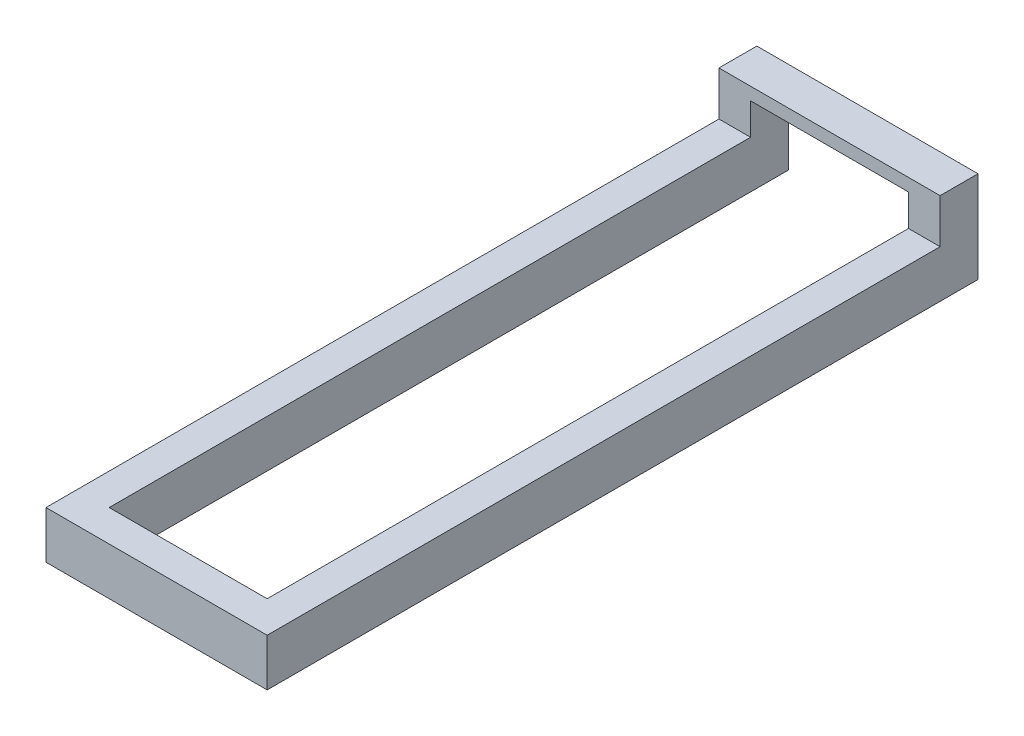
ISO-10303-21;
HEADER;
FILE_DESCRIPTION(('STEP AP214'),'2;1');
FILE_NAME('part.step','',(''),(''),'','','');
FILE_SCHEMA(('AUTOMOTIVE_DESIGN { 1 0 10303 214 1 1 1 1 }'));
ENDSEC;
DATA;
#1=APPLICATION_CONTEXT('core data for automotive mechanical design processes');
#2=APPLICATION_PROTOCOL_DEFINITION('international standard','automotive_design',2000,#1);
#3=PRODUCT_CONTEXT('',#1,'mechanical');
#4=PRODUCT('Part','Part','',(#3));
#5=PRODUCT_RELATED_PRODUCT_CATEGORY('part','',(#4));
#6=PRODUCT_DEFINITION_FORMATION('','',#4);
#7=PRODUCT_DEFINITION_CONTEXT('part definition',#1,'design');
#8=PRODUCT_DEFINITION('design','',#6,#7);
#9=PRODUCT_DEFINITION_SHAPE('','',#8);
#10=(LENGTH_UNIT() NAMED_UNIT(*) SI_UNIT(.MILLI.,.METRE.));
#11=(NAMED_UNIT(*) PLANE_ANGLE_UNIT() SI_UNIT($,.RADIAN.));
#12=(NAMED_UNIT(*) SI_UNIT($,.STERADIAN.) SOLID_ANGLE_UNIT());
#13=UNCERTAINTY_MEASURE_WITH_UNIT(LENGTH_MEASURE(1.E-05),#10,'distance_accuracy_value','');
#14=(GEOMETRIC_REPRESENTATION_CONTEXT(3) GLOBAL_UNCERTAINTY_ASSIGNED_CONTEXT((#13)) GLOBAL_UNIT_ASSIGNED_CONTEXT((#10,
#11,#12)) REPRESENTATION_CONTEXT('',''));
#15=CARTESIAN_POINT('',(0.,0.,0.));
#16=DIRECTION('',(0.,0.,1.));
#17=DIRECTION('',(1.,0.,0.));
#18=AXIS2_PLACEMENT_3D('',#15,#16,#17);
#19=CARTESIAN_POINT('',(0.,7.5,0.));
#20=DIRECTION('',(0.,1.,0.));
#21=DIRECTION('',(0.,0.,1.));
#22=AXIS2_PLACEMENT_3D('',#19,#20,#21);
#23=PLANE('',#22);
#24=DIRECTION('',(0.,0.,-1.));
#25=VECTOR('',#24,1.);
#26=CARTESIAN_POINT('',(35.,7.5,-107.5));
#27=LINE('',#26,#25);
#28=CARTESIAN_POINT('',(35.,7.5,117.5));
#29=VERTEX_POINT('',#28);
#30=CARTESIAN_POINT('',(35.,7.5,-95.4999999999999));
#31=VERTEX_POINT('',#30);
#32=EDGE_CURVE('E55',#29,#31,#27,.T.);
#33=ORIENTED_EDGE('',*,*,#32,.T.);
#34=DIRECTION('',(1.,0.,0.));
#35=VECTOR('',#34,1.);
#36=CARTESIAN_POINT('',(0.,7.5,-95.4999999999999));
#37=LINE('',#36,#35);
#38=CARTESIAN_POINT('',(25.,7.5,-95.4999999999999));
#39=VERTEX_POINT('',#38);
#40=EDGE_CURVE('E155',#39,#31,#37,.T.);
#41=ORIENTED_EDGE('',*,*,#40,.F.);
#42=DIRECTION('',(0.,0.,1.));
#43=VECTOR('',#42,1.);
#44=CARTESIAN_POINT('',(25.,7.5,-107.5));
#45=LINE('',#44,#43);
#46=CARTESIAN_POINT('',(25.,7.5,107.5));
#47=VERTEX_POINT('',#46);
#48=EDGE_CURVE('E154',#39,#47,#45,.T.);
#49=ORIENTED_EDGE('',*,*,#48,.T.);
#50=DIRECTION('',(-1.,0.,0.));
#51=VECTOR('',#50,1.);
#52=CARTESIAN_POINT('',(-25.,7.5,107.5));
#53=LINE('',#52,#51);
#54=CARTESIAN_POINT('',(-25.,7.5,107.5));
#55=VERTEX_POINT('',#54);
#56=EDGE_CURVE('E180',#47,#55,#53,.T.);
#57=ORIENTED_EDGE('',*,*,#56,.T.);
#58=DIRECTION('',(0.,0.,-1.));
#59=VECTOR('',#58,1.);
#60=CARTESIAN_POINT('',(-25.,7.5,-107.5));
#61=LINE('',#60,#59);
#62=CARTESIAN_POINT('',(-25.,7.5,-95.4999999999999));
#63=VERTEX_POINT('',#62);
#64=EDGE_CURVE('E183',#55,#63,#61,.T.);
#65=ORIENTED_EDGE('',*,*,#64,.T.);
#66=DIRECTION('',(-1.,0.,0.));
#67=VECTOR('',#66,1.);
#68=CARTESIAN_POINT('',(0.,7.5,-95.4999999999999));
#69=LINE('',#68,#67);
#70=CARTESIAN_POINT('',(-35.,7.5,-95.4999999999999));
#71=VERTEX_POINT('',#70);
#72=EDGE_CURVE('E62',#63,#71,#69,.T.);
#73=ORIENTED_EDGE('',*,*,#72,.T.);
#74=DIRECTION('',(0.,0.,1.));
#75=VECTOR('',#74,1.);
#76=CARTESIAN_POINT('',(-35.,7.5,117.5));
#77=LINE('',#76,#75);
#78=CARTESIAN_POINT('',(-35.,7.5,117.5));
#79=VERTEX_POINT('',#78);
#80=EDGE_CURVE('E185',#71,#79,#77,.T.);
#81=ORIENTED_EDGE('',*,*,#80,.T.);
#82=DIRECTION('',(1.,0.,0.));
#83=VECTOR('',#82,1.);
#84=CARTESIAN_POINT('',(35.,7.5,117.5));
#85=LINE('',#84,#83);
#86=EDGE_CURVE('E187',#79,#29,#85,.T.);
#87=ORIENTED_EDGE('',*,*,#86,.T.);
#88=EDGE_LOOP('',(#33,#41,#49,#57,#65,#73,#81,#87));
#89=FACE_BOUND('',#88,.T.);
#90=ADVANCED_FACE('F40',(#89),#23,.T.);
#91=CARTESIAN_POINT('',(25.,7.5,-107.5));
#92=DIRECTION('',(1.,0.,0.));
#93=DIRECTION('',(0.,0.,-1.));
#94=AXIS2_PLACEMENT_3D('',#91,#92,#93);
#95=PLANE('',#94);
#96=DIRECTION('',(0.,0.,1.));
#97=VECTOR('',#96,1.);
#98=CARTESIAN_POINT('',(25.,-7.5,-107.5));
#99=LINE('',#98,#97);
#100=CARTESIAN_POINT('',(25.,-7.5,-107.5));
#101=VERTEX_POINT('',#100);
#102=CARTESIAN_POINT('',(25.,-7.5,107.5));
#103=VERTEX_POINT('',#102);
#104=EDGE_CURVE('E174',#101,#103,#99,.T.);
#105=ORIENTED_EDGE('',*,*,#104,.T.);
#106=DIRECTION('',(0.,-1.,0.));
#107=VECTOR('',#106,1.);
#108=CARTESIAN_POINT('',(25.,7.5,107.5));
#109=LINE('',#108,#107);
#110=EDGE_CURVE('E11',#47,#103,#109,.T.);
#111=ORIENTED_EDGE('',*,*,#110,.F.);
#112=ORIENTED_EDGE('',*,*,#48,.F.);
#113=DIRECTION('',(0.,1.,0.));
#114=VECTOR('',#113,1.);
#115=CARTESIAN_POINT('',(24.9999999999999,0.,-95.4999999999999));
#116=LINE('',#115,#114);
#117=CARTESIAN_POINT('',(24.9999999999999,17.5,-95.4999999999999));
#118=VERTEX_POINT('',#117);
#119=EDGE_CURVE('E146',#39,#118,#116,.T.);
#120=ORIENTED_EDGE('',*,*,#119,.T.);
#121=DIRECTION('',(0.,0.,-1.));
#122=VECTOR('',#121,1.);
#123=CARTESIAN_POINT('',(24.9999999999999,17.5,-95.4999999999999));
#124=LINE('',#123,#122);
#125=CARTESIAN_POINT('',(24.9999999999999,17.5,-107.5));
#126=VERTEX_POINT('',#125);
#127=EDGE_CURVE('E129',#118,#126,#124,.T.);
#128=ORIENTED_EDGE('',*,*,#127,.T.);
#129=DIRECTION('',(0.,-1.,0.));
#130=VECTOR('',#129,1.);
#131=CARTESIAN_POINT('',(25.,7.5,-107.5));
#132=LINE('',#131,#130);
#133=EDGE_CURVE('E190',#126,#101,#132,.T.);
#134=ORIENTED_EDGE('',*,*,#133,.T.);
#135=EDGE_LOOP('',(#105,#111,#112,#120,#128,#134));
#136=FACE_BOUND('',#135,.T.);
#137=ADVANCED_FACE('F42',(#136),#95,.F.);
#138=CARTESIAN_POINT('',(-25.,7.5,107.5));
#139=DIRECTION('',(0.,0.,1.));
#140=DIRECTION('',(1.,0.,0.));
#141=AXIS2_PLACEMENT_3D('',#138,#139,#140);
#142=PLANE('',#141);
#143=DIRECTION('',(-1.,0.,0.));
#144=VECTOR('',#143,1.);
#145=CARTESIAN_POINT('',(-25.,-7.5,107.5));
#146=LINE('',#145,#144);
#147=CARTESIAN_POINT('',(-25.,-7.5,107.5));
#148=VERTEX_POINT('',#147);
#149=EDGE_CURVE('E192',#103,#148,#146,.T.);
#150=ORIENTED_EDGE('',*,*,#149,.T.);
#151=DIRECTION('',(0.,-1.,0.));
#152=VECTOR('',#151,1.);
#153=CARTESIAN_POINT('',(-25.,7.5,107.5));
#154=LINE('',#153,#152);
#155=EDGE_CURVE('E48',#55,#148,#154,.T.);
#156=ORIENTED_EDGE('',*,*,#155,.F.);
#157=ORIENTED_EDGE('',*,*,#56,.F.);
#158=ORIENTED_EDGE('',*,*,#110,.T.);
#159=EDGE_LOOP('',(#150,#156,#157,#158));
#160=FACE_BOUND('',#159,.T.);
#161=ADVANCED_FACE('F249',(#160),#142,.F.);
#162=CARTESIAN_POINT('',(-25.,7.5,-107.5));
#163=DIRECTION('',(-1.,0.,0.));
#164=DIRECTION('',(0.,0.,1.));
#165=AXIS2_PLACEMENT_3D('',#162,#163,#164);
#166=PLANE('',#165);
#167=DIRECTION('',(0.,0.,-1.));
#168=VECTOR('',#167,1.);
#169=CARTESIAN_POINT('',(-25.,-7.5,-107.5));
#170=LINE('',#169,#168);
#171=CARTESIAN_POINT('',(-25.,-7.5,-107.5));
#172=VERTEX_POINT('',#171);
#173=EDGE_CURVE('E194',#148,#172,#170,.T.);
#174=ORIENTED_EDGE('',*,*,#173,.T.);
#175=DIRECTION('',(0.,-1.,0.));
#176=VECTOR('',#175,1.);
#177=CARTESIAN_POINT('',(-25.,7.5,-107.5));
#178=LINE('',#177,#176);
#179=CARTESIAN_POINT('',(-25.0000000000002,17.5,-107.5));
#180=VERTEX_POINT('',#179);
#181=EDGE_CURVE('E218',#180,#172,#178,.T.);
#182=ORIENTED_EDGE('',*,*,#181,.F.);
#183=DIRECTION('',(0.,0.,-1.));
#184=VECTOR('',#183,1.);
#185=CARTESIAN_POINT('',(-25.0000000000002,17.5,-95.4999999999999));
#186=LINE('',#185,#184);
#187=CARTESIAN_POINT('',(-25.0000000000002,17.5,-95.4999999999999));
#188=VERTEX_POINT('',#187);
#189=EDGE_CURVE('E139',#188,#180,#186,.T.);
#190=ORIENTED_EDGE('',*,*,#189,.F.);
#191=DIRECTION('',(0.,1.,0.));
#192=VECTOR('',#191,1.);
#193=CARTESIAN_POINT('',(-25.0000000000002,0.,-95.4999999999999));
#194=LINE('',#193,#192);
#195=EDGE_CURVE('E148',#63,#188,#194,.T.);
#196=ORIENTED_EDGE('',*,*,#195,.F.);
#197=ORIENTED_EDGE('',*,*,#64,.F.);
#198=ORIENTED_EDGE('',*,*,#155,.T.);
#199=EDGE_LOOP('',(#174,#182,#190,#196,#197,#198));
#200=FACE_BOUND('',#199,.T.);
#201=ADVANCED_FACE('F225',(#200),#166,.F.);
#202=CARTESIAN_POINT('',(-35.,7.5,117.5));
#203=DIRECTION('',(1.,0.,0.));
#204=DIRECTION('',(0.,0.,-1.));
#205=AXIS2_PLACEMENT_3D('',#202,#203,#204);
#206=PLANE('',#205);
#207=DIRECTION('',(0.,0.,1.));
#208=VECTOR('',#207,1.);
#209=CARTESIAN_POINT('',(-35.,-7.5,117.5));
#210=LINE('',#209,#208);
#211=CARTESIAN_POINT('',(-35.,-7.5,-107.5));
#212=VERTEX_POINT('',#211);
#213=CARTESIAN_POINT('',(-35.,-7.5,117.5));
#214=VERTEX_POINT('',#213);
#215=EDGE_CURVE('E198',#212,#214,#210,.T.);
#216=ORIENTED_EDGE('',*,*,#215,.T.);
#217=DIRECTION('',(0.,-1.,0.));
#218=VECTOR('',#217,1.);
#219=CARTESIAN_POINT('',(-35.,7.5,117.5));
#220=LINE('',#219,#218);
#221=EDGE_CURVE('E212',#79,#214,#220,.T.);
#222=ORIENTED_EDGE('',*,*,#221,.F.);
#223=ORIENTED_EDGE('',*,*,#80,.F.);
#224=DIRECTION('',(0.,1.,0.));
#225=VECTOR('',#224,1.);
#226=CARTESIAN_POINT('',(-35.0000000000002,0.,-95.4999999999999));
#227=LINE('',#226,#225);
#228=CARTESIAN_POINT('',(-35.0000000000002,21.5,-95.4999999999999));
#229=VERTEX_POINT('',#228);
#230=EDGE_CURVE('E162',#71,#229,#227,.T.);
#231=ORIENTED_EDGE('',*,*,#230,.T.);
#232=DIRECTION('',(0.,0.,-1.));
#233=VECTOR('',#232,1.);
#234=CARTESIAN_POINT('',(-35.0000000000002,21.5,-95.4999999999999));
#235=LINE('',#234,#233);
#236=CARTESIAN_POINT('',(-35.0000000000002,21.5,-107.5));
#237=VERTEX_POINT('',#236);
#238=EDGE_CURVE('E175',#229,#237,#235,.T.);
#239=ORIENTED_EDGE('',*,*,#238,.T.);
#240=DIRECTION('',(0.,-1.,0.));
#241=VECTOR('',#240,1.);
#242=CARTESIAN_POINT('',(-35.,7.5,-107.5));
#243=LINE('',#242,#241);
#244=EDGE_CURVE('E215',#237,#212,#243,.T.);
#245=ORIENTED_EDGE('',*,*,#244,.T.);
#246=EDGE_LOOP('',(#216,#222,#223,#231,#239,#245));
#247=FACE_BOUND('',#246,.T.);
#248=ADVANCED_FACE('F238',(#247),#206,.F.);
#249=CARTESIAN_POINT('',(35.,7.5,117.5));
#250=DIRECTION('',(0.,0.,-1.));
#251=DIRECTION('',(-1.,0.,0.));
#252=AXIS2_PLACEMENT_3D('',#249,#250,#251);
#253=PLANE('',#252);
#254=DIRECTION('',(1.,0.,0.));
#255=VECTOR('',#254,1.);
#256=CARTESIAN_POINT('',(35.,-7.5,117.5));
#257=LINE('',#256,#255);
#258=CARTESIAN_POINT('',(35.,-7.5,117.5));
#259=VERTEX_POINT('',#258);
#260=EDGE_CURVE('E200',#214,#259,#257,.T.);
#261=ORIENTED_EDGE('',*,*,#260,.T.);
#262=DIRECTION('',(0.,-1.,0.));
#263=VECTOR('',#262,1.);
#264=CARTESIAN_POINT('',(35.,7.5,117.5));
#265=LINE('',#264,#263);
#266=EDGE_CURVE('E209',#29,#259,#265,.T.);
#267=ORIENTED_EDGE('',*,*,#266,.F.);
#268=ORIENTED_EDGE('',*,*,#86,.F.);
#269=ORIENTED_EDGE('',*,*,#221,.T.);
#270=EDGE_LOOP('',(#261,#267,#268,#269));
#271=FACE_BOUND('',#270,.T.);
#272=ADVANCED_FACE('F252',(#271),#253,.F.);
#273=CARTESIAN_POINT('',(35.,7.5,-107.5));
#274=DIRECTION('',(-1.,0.,0.));
#275=DIRECTION('',(0.,0.,1.));
#276=AXIS2_PLACEMENT_3D('',#273,#274,#275);
#277=PLANE('',#276);
#278=DIRECTION('',(0.,0.,-1.));
#279=VECTOR('',#278,1.);
#280=CARTESIAN_POINT('',(35.,-7.5,-107.5));
#281=LINE('',#280,#279);
#282=CARTESIAN_POINT('',(35.,-7.5,-107.5));
#283=VERTEX_POINT('',#282);
#284=EDGE_CURVE('E202',#259,#283,#281,.T.);
#285=ORIENTED_EDGE('',*,*,#284,.T.);
#286=DIRECTION('',(0.,-1.,0.));
#287=VECTOR('',#286,1.);
#288=CARTESIAN_POINT('',(35.,7.5,-107.5));
#289=LINE('',#288,#287);
#290=CARTESIAN_POINT('',(34.9999999999998,21.5,-107.5));
#291=VERTEX_POINT('',#290);
#292=EDGE_CURVE('E206',#291,#283,#289,.T.);
#293=ORIENTED_EDGE('',*,*,#292,.F.);
#294=DIRECTION('',(0.,0.,-1.));
#295=VECTOR('',#294,1.);
#296=CARTESIAN_POINT('',(34.9999999999998,21.5,-95.4999999999999));
#297=LINE('',#296,#295);
#298=CARTESIAN_POINT('',(34.9999999999998,21.5,-95.4999999999999));
#299=VERTEX_POINT('',#298);
#300=EDGE_CURVE('E171',#299,#291,#297,.T.);
#301=ORIENTED_EDGE('',*,*,#300,.F.);
#302=DIRECTION('',(0.,1.,0.));
#303=VECTOR('',#302,1.);
#304=CARTESIAN_POINT('',(34.9999999999998,0.,-95.4999999999999));
#305=LINE('',#304,#303);
#306=EDGE_CURVE('E140',#31,#299,#305,.T.);
#307=ORIENTED_EDGE('',*,*,#306,.F.);
#308=ORIENTED_EDGE('',*,*,#32,.F.);
#309=ORIENTED_EDGE('',*,*,#266,.T.);
#310=EDGE_LOOP('',(#285,#293,#301,#307,#308,#309));
#311=FACE_BOUND('',#310,.T.);
#312=ADVANCED_FACE('F250',(#311),#277,.F.);
#313=CARTESIAN_POINT('',(25.,7.5,-107.5));
#314=DIRECTION('',(0.,0.,1.));
#315=DIRECTION('',(1.,0.,0.));
#316=AXIS2_PLACEMENT_3D('',#313,#314,#315);
#317=PLANE('',#316);
#318=DIRECTION('',(-1.,0.,0.));
#319=VECTOR('',#318,1.);
#320=CARTESIAN_POINT('',(25.,-7.5,-107.5));
#321=LINE('',#320,#319);
#322=EDGE_CURVE('E181',#283,#101,#321,.T.);
#323=ORIENTED_EDGE('',*,*,#322,.T.);
#324=ORIENTED_EDGE('',*,*,#133,.F.);
#325=DIRECTION('',(-1.,0.,0.));
#326=VECTOR('',#325,1.);
#327=CARTESIAN_POINT('',(0.,17.5,-107.5));
#328=LINE('',#327,#326);
#329=EDGE_CURVE('E135',#126,#180,#328,.T.);
#330=ORIENTED_EDGE('',*,*,#329,.T.);
#331=ORIENTED_EDGE('',*,*,#181,.T.);
#332=DIRECTION('',(-1.,0.,0.));
#333=VECTOR('',#332,1.);
#334=CARTESIAN_POINT('',(-35.,-7.5,-107.5));
#335=LINE('',#334,#333);
#336=EDGE_CURVE('E196',#172,#212,#335,.T.);
#337=ORIENTED_EDGE('',*,*,#336,.T.);
#338=ORIENTED_EDGE('',*,*,#244,.F.);
#339=DIRECTION('',(-1.,0.,0.));
#340=VECTOR('',#339,1.);
#341=CARTESIAN_POINT('',(0.,21.5,-107.5));
#342=LINE('',#341,#340);
#343=EDGE_CURVE('E157',#291,#237,#342,.T.);
#344=ORIENTED_EDGE('',*,*,#343,.F.);
#345=ORIENTED_EDGE('',*,*,#292,.T.);
#346=EDGE_LOOP('',(#323,#324,#330,#331,#337,#338,#344,#345));
#347=FACE_BOUND('',#346,.T.);
#348=ADVANCED_FACE('F235',(#347),#317,.F.);
#349=CARTESIAN_POINT('',(0.,-7.5,0.));
#350=DIRECTION('',(0.,1.,0.));
#351=DIRECTION('',(0.,0.,1.));
#352=AXIS2_PLACEMENT_3D('',#349,#350,#351);
#353=PLANE('',#352);
#354=ORIENTED_EDGE('',*,*,#104,.F.);
#355=ORIENTED_EDGE('',*,*,#322,.F.);
#356=ORIENTED_EDGE('',*,*,#284,.F.);
#357=ORIENTED_EDGE('',*,*,#260,.F.);
#358=ORIENTED_EDGE('',*,*,#215,.F.);
#359=ORIENTED_EDGE('',*,*,#336,.F.);
#360=ORIENTED_EDGE('',*,*,#173,.F.);
#361=ORIENTED_EDGE('',*,*,#149,.F.);
#362=EDGE_LOOP('',(#354,#355,#356,#357,#358,#359,#360,#361));
#363=FACE_BOUND('',#362,.T.);
#364=ADVANCED_FACE('F231',(#363),#353,.F.);
#365=CARTESIAN_POINT('',(0.,21.5,-95.4999999999999));
#366=DIRECTION('',(0.,-1.,0.));
#367=DIRECTION('',(0.,0.,-1.));
#368=AXIS2_PLACEMENT_3D('',#365,#366,#367);
#369=PLANE('',#368);
#370=ORIENTED_EDGE('',*,*,#343,.T.);
#371=ORIENTED_EDGE('',*,*,#238,.F.);
#372=DIRECTION('',(-1.,0.,0.));
#373=VECTOR('',#372,1.);
#374=CARTESIAN_POINT('',(0.,21.5,-95.4999999999999));
#375=LINE('',#374,#373);
#376=EDGE_CURVE('E165',#299,#229,#375,.T.);
#377=ORIENTED_EDGE('',*,*,#376,.F.);
#378=ORIENTED_EDGE('',*,*,#300,.T.);
#379=EDGE_LOOP('',(#370,#371,#377,#378));
#380=FACE_BOUND('',#379,.T.);
#381=ADVANCED_FACE('F244',(#380),#369,.F.);
#382=CARTESIAN_POINT('',(0.,17.5,-95.4999999999999));
#383=DIRECTION('',(0.,-1.,0.));
#384=DIRECTION('',(0.,0.,-1.));
#385=AXIS2_PLACEMENT_3D('',#382,#383,#384);
#386=PLANE('',#385);
#387=ORIENTED_EDGE('',*,*,#329,.F.);
#388=ORIENTED_EDGE('',*,*,#127,.F.);
#389=DIRECTION('',(-1.,0.,0.));
#390=VECTOR('',#389,1.);
#391=CARTESIAN_POINT('',(0.,17.5,-95.4999999999999));
#392=LINE('',#391,#390);
#393=EDGE_CURVE('E133',#118,#188,#392,.T.);
#394=ORIENTED_EDGE('',*,*,#393,.T.);
#395=ORIENTED_EDGE('',*,*,#189,.T.);
#396=EDGE_LOOP('',(#387,#388,#394,#395));
#397=FACE_BOUND('',#396,.T.);
#398=ADVANCED_FACE('F131',(#397),#386,.T.);
#399=CARTESIAN_POINT('',(0.,0.,-95.4999999999999));
#400=DIRECTION('',(0.,0.,-1.));
#401=DIRECTION('',(-1.,0.,0.));
#402=AXIS2_PLACEMENT_3D('',#399,#400,#401);
#403=PLANE('',#402);
#404=ORIENTED_EDGE('',*,*,#40,.T.);
#405=ORIENTED_EDGE('',*,*,#306,.T.);
#406=ORIENTED_EDGE('',*,*,#376,.T.);
#407=ORIENTED_EDGE('',*,*,#230,.F.);
#408=ORIENTED_EDGE('',*,*,#72,.F.);
#409=ORIENTED_EDGE('',*,*,#195,.T.);
#410=ORIENTED_EDGE('',*,*,#393,.F.);
#411=ORIENTED_EDGE('',*,*,#119,.F.);
#412=EDGE_LOOP('',(#404,#405,#406,#407,#408,#409,#410,#411));
#413=FACE_BOUND('',#412,.T.);
#414=ADVANCED_FACE('F145',(#413),#403,.F.);
#415=CLOSED_SHELL('',(#90,#137,#161,#201,#248,#272,#312,#348,#364,#381,#398,#414));
#416=MANIFOLD_SOLID_BREP('B2',#415);
#417=ADVANCED_BREP_SHAPE_REPRESENTATION('',(#18,#416),#14);
#418=SHAPE_DEFINITION_REPRESENTATION(#9,#417);
ENDSEC;
END-ISO-10303-21;
